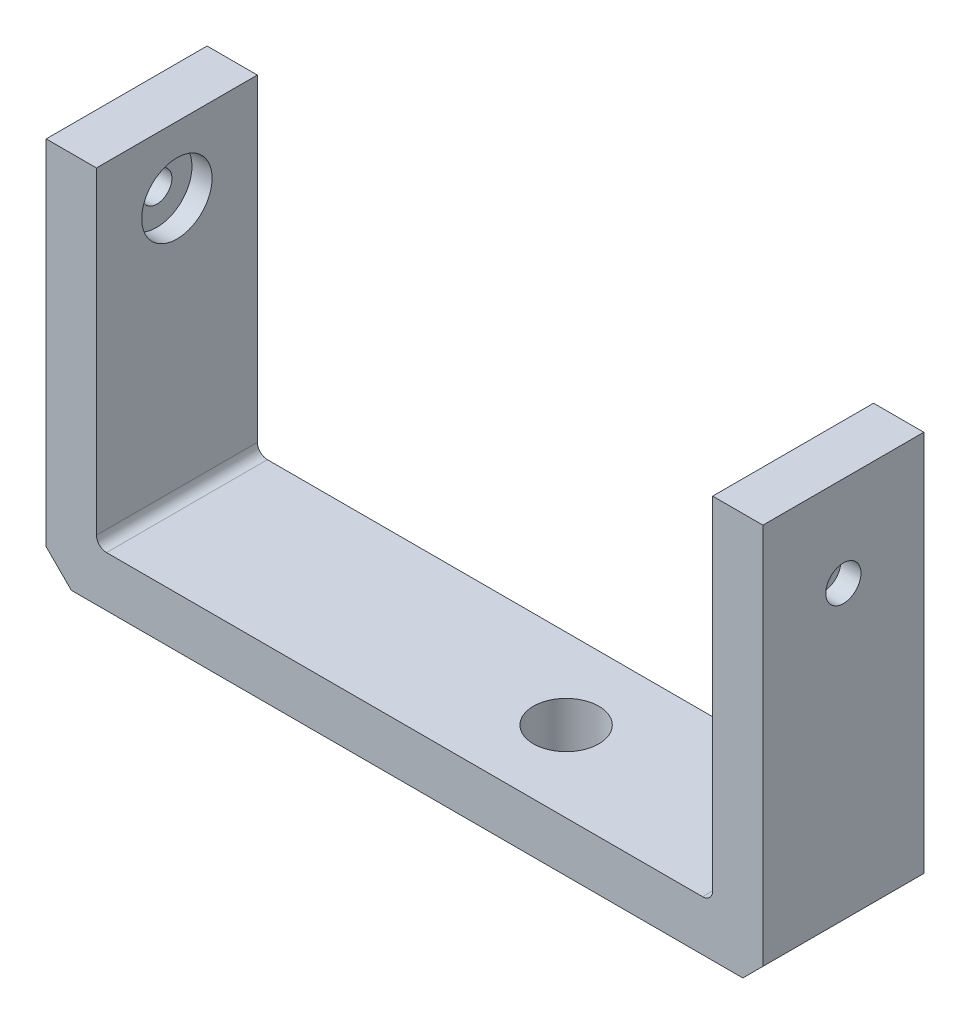
ISO-10303-21;
HEADER;
FILE_DESCRIPTION(('STEP AP214'),'2;1');
FILE_NAME('part.step','',(''),(''),'','','');
FILE_SCHEMA(('AUTOMOTIVE_DESIGN { 1 0 10303 214 1 1 1 1 }'));
ENDSEC;
DATA;
#1=APPLICATION_CONTEXT('core data for automotive mechanical design processes');
#2=APPLICATION_PROTOCOL_DEFINITION('international standard','automotive_design',2000,#1);
#3=PRODUCT_CONTEXT('',#1,'mechanical');
#4=PRODUCT('Part','Part','',(#3));
#5=PRODUCT_RELATED_PRODUCT_CATEGORY('part','',(#4));
#6=PRODUCT_DEFINITION_FORMATION('','',#4);
#7=PRODUCT_DEFINITION_CONTEXT('part definition',#1,'design');
#8=PRODUCT_DEFINITION('design','',#6,#7);
#9=PRODUCT_DEFINITION_SHAPE('','',#8);
#10=(LENGTH_UNIT() NAMED_UNIT(*) SI_UNIT(.MILLI.,.METRE.));
#11=(NAMED_UNIT(*) PLANE_ANGLE_UNIT() SI_UNIT($,.RADIAN.));
#12=(NAMED_UNIT(*) SI_UNIT($,.STERADIAN.) SOLID_ANGLE_UNIT());
#13=UNCERTAINTY_MEASURE_WITH_UNIT(LENGTH_MEASURE(1.E-05),#10,'distance_accuracy_value','');
#14=(GEOMETRIC_REPRESENTATION_CONTEXT(3) GLOBAL_UNCERTAINTY_ASSIGNED_CONTEXT((#13)) GLOBAL_UNIT_ASSIGNED_CONTEXT((#10,
#11,#12)) REPRESENTATION_CONTEXT('',''));
#15=CARTESIAN_POINT('',(0.,0.,0.));
#16=DIRECTION('',(0.,0.,1.));
#17=DIRECTION('',(1.,0.,0.));
#18=AXIS2_PLACEMENT_3D('',#15,#16,#17);
#19=CARTESIAN_POINT('',(0.,-5.48275862068966,16.));
#20=DIRECTION('',(0.,1.,0.));
#21=DIRECTION('',(0.,0.,1.));
#22=AXIS2_PLACEMENT_3D('',#19,#20,#21);
#23=PLANE('',#22);
#24=CARTESIAN_POINT('',(-11.1921641877615,-5.48275862068966,8.));
#25=DIRECTION('',(0.,1.,0.));
#26=DIRECTION('',(0.,0.,1.));
#27=AXIS2_PLACEMENT_3D('',#24,#25,#26);
#28=CIRCLE('',#27,3.25);
#29=CARTESIAN_POINT('',(-11.1921641877615,-5.48275862068966,11.25));
#30=VERTEX_POINT('',#29);
#31=EDGE_CURVE('E170',#30,#30,#28,.T.);
#32=ORIENTED_EDGE('',*,*,#31,.F.);
#33=EDGE_LOOP('',(#32));
#34=FACE_BOUND('',#33,.T.);
#35=DIRECTION('',(1.,0.,0.));
#36=VECTOR('',#35,1.);
#37=CARTESIAN_POINT('',(0.,-5.48275862068966,0.));
#38=LINE('',#37,#36);
#39=CARTESIAN_POINT('',(-48.896551724138,-5.48275862068966,0.));
#40=VERTEX_POINT('',#39);
#41=CARTESIAN_POINT('',(10.3793103448276,-5.48275862068966,0.));
#42=VERTEX_POINT('',#41);
#43=EDGE_CURVE('E196',#40,#42,#38,.T.);
#44=ORIENTED_EDGE('',*,*,#43,.F.);
#45=DIRECTION('',(0.,0.,-1.));
#46=VECTOR('',#45,1.);
#47=CARTESIAN_POINT('',(-48.896551724138,-5.48275862068966,16.));
#48=LINE('',#47,#46);
#49=CARTESIAN_POINT('',(-48.896551724138,-5.48275862068966,16.));
#50=VERTEX_POINT('',#49);
#51=EDGE_CURVE('E58',#40,#50,#48,.F.);
#52=ORIENTED_EDGE('',*,*,#51,.T.);
#53=DIRECTION('',(1.,0.,0.));
#54=VECTOR('',#53,1.);
#55=CARTESIAN_POINT('',(0.,-5.48275862068966,16.));
#56=LINE('',#55,#54);
#57=CARTESIAN_POINT('',(10.3793103448276,-5.48275862068966,16.));
#58=VERTEX_POINT('',#57);
#59=EDGE_CURVE('E182',#50,#58,#56,.T.);
#60=ORIENTED_EDGE('',*,*,#59,.T.);
#61=DIRECTION('',(0.,0.,-1.));
#62=VECTOR('',#61,1.);
#63=CARTESIAN_POINT('',(10.3793103448276,-5.48275862068966,16.));
#64=LINE('',#63,#62);
#65=EDGE_CURVE('E205',#58,#42,#64,.T.);
#66=ORIENTED_EDGE('',*,*,#65,.T.);
#67=EDGE_LOOP('',(#44,#52,#60,#66));
#68=FACE_BOUND('',#67,.T.);
#69=ADVANCED_FACE('F35',(#34,#68),#23,.T.);
#70=CARTESIAN_POINT('',(31.3793103448276,20.5172413793103,8.));
#71=DIRECTION('',(-1.,0.,0.));
#72=DIRECTION('',(0.,-1.,0.));
#73=AXIS2_PLACEMENT_3D('',#70,#71,#72);
#74=CYLINDRICAL_SURFACE('',#73,1.75);
#75=CARTESIAN_POINT('',(16.3793103448276,20.5172413793103,8.));
#76=DIRECTION('',(1.,0.,0.));
#77=DIRECTION('',(0.,1.,0.));
#78=AXIS2_PLACEMENT_3D('',#75,#76,#77);
#79=CIRCLE('',#78,1.75);
#80=CARTESIAN_POINT('',(16.3793103448276,22.2672413793103,8.));
#81=VERTEX_POINT('',#80);
#82=EDGE_CURVE('E174',#81,#81,#79,.T.);
#83=ORIENTED_EDGE('',*,*,#82,.T.);
#84=EDGE_LOOP('',(#83));
#85=FACE_BOUND('',#84,.T.);
#86=CARTESIAN_POINT('',(14.3793103448276,20.5172413793103,8.));
#87=DIRECTION('',(-1.,0.,0.));
#88=DIRECTION('',(0.,-1.,0.));
#89=AXIS2_PLACEMENT_3D('',#86,#87,#88);
#90=CIRCLE('',#89,1.75);
#91=CARTESIAN_POINT('',(14.3793103448276,18.7672413793103,8.));
#92=VERTEX_POINT('',#91);
#93=EDGE_CURVE('E169',#92,#92,#90,.F.);
#94=ORIENTED_EDGE('',*,*,#93,.F.);
#95=EDGE_LOOP('',(#94));
#96=FACE_BOUND('',#95,.T.);
#97=ADVANCED_FACE('F309',(#85,#96),#74,.F.);
#98=CARTESIAN_POINT('',(0.,29.5172413793103,16.));
#99=DIRECTION('',(0.,1.,0.));
#100=DIRECTION('',(0.,0.,1.));
#101=AXIS2_PLACEMENT_3D('',#98,#99,#100);
#102=PLANE('',#101);
#103=DIRECTION('',(1.,0.,0.));
#104=VECTOR('',#103,1.);
#105=CARTESIAN_POINT('',(0.,29.5172413793103,0.));
#106=LINE('',#105,#104);
#107=CARTESIAN_POINT('',(11.3793103448276,29.5172413793103,0.));
#108=VERTEX_POINT('',#107);
#109=CARTESIAN_POINT('',(16.3793103448276,29.5172413793103,0.));
#110=VERTEX_POINT('',#109);
#111=EDGE_CURVE('E190',#108,#110,#106,.T.);
#112=ORIENTED_EDGE('',*,*,#111,.F.);
#113=DIRECTION('',(0.,0.,-1.));
#114=VECTOR('',#113,1.);
#115=CARTESIAN_POINT('',(11.3793103448276,29.5172413793103,16.));
#116=LINE('',#115,#114);
#117=CARTESIAN_POINT('',(11.3793103448276,29.5172413793103,16.));
#118=VERTEX_POINT('',#117);
#119=EDGE_CURVE('E203',#118,#108,#116,.T.);
#120=ORIENTED_EDGE('',*,*,#119,.F.);
#121=DIRECTION('',(1.,0.,0.));
#122=VECTOR('',#121,1.);
#123=CARTESIAN_POINT('',(0.,29.5172413793103,16.));
#124=LINE('',#123,#122);
#125=CARTESIAN_POINT('',(16.3793103448276,29.5172413793103,16.));
#126=VERTEX_POINT('',#125);
#127=EDGE_CURVE('E175',#118,#126,#124,.T.);
#128=ORIENTED_EDGE('',*,*,#127,.T.);
#129=DIRECTION('',(0.,0.,-1.));
#130=VECTOR('',#129,1.);
#131=CARTESIAN_POINT('',(16.3793103448276,29.5172413793103,16.));
#132=LINE('',#131,#130);
#133=EDGE_CURVE('E189',#126,#110,#132,.T.);
#134=ORIENTED_EDGE('',*,*,#133,.T.);
#135=EDGE_LOOP('',(#112,#120,#128,#134));
#136=FACE_BOUND('',#135,.T.);
#137=ADVANCED_FACE('F259',(#136),#102,.T.);
#138=CARTESIAN_POINT('',(11.3793103448276,0.,16.));
#139=DIRECTION('',(1.,0.,0.));
#140=DIRECTION('',(0.,1.,0.));
#141=AXIS2_PLACEMENT_3D('',#138,#139,#140);
#142=PLANE('',#141);
#143=CARTESIAN_POINT('',(11.3793103448276,20.5172413793103,8.));
#144=DIRECTION('',(-1.,0.,0.));
#145=DIRECTION('',(0.,-1.,0.));
#146=AXIS2_PLACEMENT_3D('',#143,#144,#145);
#147=CIRCLE('',#146,3.);
#148=CARTESIAN_POINT('',(11.3793103448276,17.5172413793103,8.));
#149=VERTEX_POINT('',#148);
#150=EDGE_CURVE('E166',#149,#149,#147,.T.);
#151=ORIENTED_EDGE('',*,*,#150,.F.);
#152=EDGE_LOOP('',(#151));
#153=FACE_BOUND('',#152,.T.);
#154=DIRECTION('',(0.,-1.,0.));
#155=VECTOR('',#154,1.);
#156=CARTESIAN_POINT('',(11.3793103448276,0.,0.));
#157=LINE('',#156,#155);
#158=CARTESIAN_POINT('',(11.3793103448276,-4.48275862068966,0.));
#159=VERTEX_POINT('',#158);
#160=EDGE_CURVE('E193',#108,#159,#157,.T.);
#161=ORIENTED_EDGE('',*,*,#160,.T.);
#162=DIRECTION('',(0.,0.,-1.));
#163=VECTOR('',#162,1.);
#164=CARTESIAN_POINT('',(11.3793103448276,-4.48275862068966,16.));
#165=LINE('',#164,#163);
#166=CARTESIAN_POINT('',(11.3793103448276,-4.48275862068966,16.));
#167=VERTEX_POINT('',#166);
#168=EDGE_CURVE('E210',#159,#167,#165,.F.);
#169=ORIENTED_EDGE('',*,*,#168,.T.);
#170=DIRECTION('',(0.,-1.,0.));
#171=VECTOR('',#170,1.);
#172=CARTESIAN_POINT('',(11.3793103448276,0.,16.));
#173=LINE('',#172,#171);
#174=EDGE_CURVE('E178',#118,#167,#173,.T.);
#175=ORIENTED_EDGE('',*,*,#174,.F.);
#176=ORIENTED_EDGE('',*,*,#119,.T.);
#177=EDGE_LOOP('',(#161,#169,#175,#176));
#178=FACE_BOUND('',#177,.T.);
#179=ADVANCED_FACE('F257',(#153,#178),#142,.F.);
#180=CARTESIAN_POINT('',(0.,-10.4827586206897,16.));
#181=DIRECTION('',(0.,1.,0.));
#182=DIRECTION('',(0.,0.,1.));
#183=AXIS2_PLACEMENT_3D('',#180,#181,#182);
#184=PLANE('',#183);
#185=CARTESIAN_POINT('',(-11.1921641877615,-10.4827586206897,8.));
#186=DIRECTION('',(0.,1.,0.));
#187=DIRECTION('',(0.,0.,1.));
#188=AXIS2_PLACEMENT_3D('',#185,#186,#187);
#189=CIRCLE('',#188,3.25);
#190=CARTESIAN_POINT('',(-11.1921641877615,-10.4827586206897,11.25));
#191=VERTEX_POINT('',#190);
#192=EDGE_CURVE('E173',#191,#191,#189,.T.);
#193=ORIENTED_EDGE('',*,*,#192,.T.);
#194=EDGE_LOOP('',(#193));
#195=FACE_BOUND('',#194,.T.);
#196=DIRECTION('',(1.,0.,0.));
#197=VECTOR('',#196,1.);
#198=CARTESIAN_POINT('',(0.,-10.4827586206897,16.));
#199=LINE('',#198,#197);
#200=CARTESIAN_POINT('',(-52.3965517241379,-10.4827586206897,16.));
#201=VERTEX_POINT('',#200);
#202=CARTESIAN_POINT('',(14.3793103448276,-10.4827586206897,16.));
#203=VERTEX_POINT('',#202);
#204=EDGE_CURVE('E184',#201,#203,#199,.T.);
#205=ORIENTED_EDGE('',*,*,#204,.F.);
#206=DIRECTION('',(0.,0.,-1.));
#207=VECTOR('',#206,1.);
#208=CARTESIAN_POINT('',(-52.3965517241379,-10.4827586206897,0.));
#209=LINE('',#208,#207);
#210=CARTESIAN_POINT('',(-52.3965517241379,-10.4827586206897,0.));
#211=VERTEX_POINT('',#210);
#212=EDGE_CURVE('E237',#201,#211,#209,.T.);
#213=ORIENTED_EDGE('',*,*,#212,.T.);
#214=DIRECTION('',(1.,0.,0.));
#215=VECTOR('',#214,1.);
#216=CARTESIAN_POINT('',(0.,-10.4827586206897,0.));
#217=LINE('',#216,#215);
#218=CARTESIAN_POINT('',(14.3793103448276,-10.4827586206897,0.));
#219=VERTEX_POINT('',#218);
#220=EDGE_CURVE('E198',#211,#219,#217,.T.);
#221=ORIENTED_EDGE('',*,*,#220,.T.);
#222=DIRECTION('',(0.,0.,1.));
#223=VECTOR('',#222,1.);
#224=CARTESIAN_POINT('',(14.3793103448276,-10.4827586206897,16.));
#225=LINE('',#224,#223);
#226=EDGE_CURVE('E223',#219,#203,#225,.T.);
#227=ORIENTED_EDGE('',*,*,#226,.T.);
#228=EDGE_LOOP('',(#205,#213,#221,#227));
#229=FACE_BOUND('',#228,.T.);
#230=ADVANCED_FACE('F322',(#195,#229),#184,.F.);
#231=CARTESIAN_POINT('',(16.3793103448276,0.,16.));
#232=DIRECTION('',(1.,0.,0.));
#233=DIRECTION('',(0.,1.,0.));
#234=AXIS2_PLACEMENT_3D('',#231,#232,#233);
#235=PLANE('',#234);
#236=ORIENTED_EDGE('',*,*,#82,.F.);
#237=EDGE_LOOP('',(#236));
#238=FACE_BOUND('',#237,.T.);
#239=DIRECTION('',(0.,-1.,0.));
#240=VECTOR('',#239,1.);
#241=CARTESIAN_POINT('',(16.3793103448276,0.,16.));
#242=LINE('',#241,#240);
#243=CARTESIAN_POINT('',(16.3793103448276,-8.48275862068966,16.));
#244=VERTEX_POINT('',#243);
#245=EDGE_CURVE('E186',#126,#244,#242,.T.);
#246=ORIENTED_EDGE('',*,*,#245,.T.);
#247=DIRECTION('',(0.,0.,-1.));
#248=VECTOR('',#247,1.);
#249=CARTESIAN_POINT('',(16.3793103448276,-8.48275862068966,0.));
#250=LINE('',#249,#248);
#251=CARTESIAN_POINT('',(16.3793103448276,-8.48275862068966,0.));
#252=VERTEX_POINT('',#251);
#253=EDGE_CURVE('E217',#244,#252,#250,.T.);
#254=ORIENTED_EDGE('',*,*,#253,.T.);
#255=DIRECTION('',(0.,-1.,0.));
#256=VECTOR('',#255,1.);
#257=CARTESIAN_POINT('',(16.3793103448276,0.,0.));
#258=LINE('',#257,#256);
#259=EDGE_CURVE('E179',#110,#252,#258,.T.);
#260=ORIENTED_EDGE('',*,*,#259,.F.);
#261=ORIENTED_EDGE('',*,*,#133,.F.);
#262=EDGE_LOOP('',(#246,#254,#260,#261));
#263=FACE_BOUND('',#262,.T.);
#264=ADVANCED_FACE('F263',(#238,#263),#235,.T.);
#265=CARTESIAN_POINT('',(0.,0.,16.));
#266=DIRECTION('',(0.,0.,1.));
#267=DIRECTION('',(1.,0.,0.));
#268=AXIS2_PLACEMENT_3D('',#265,#266,#267);
#269=PLANE('',#268);
#270=DIRECTION('',(1.,0.,0.));
#271=VECTOR('',#270,1.);
#272=CARTESIAN_POINT('',(-61.896551724138,27.140932446315,16.));
#273=LINE('',#272,#271);
#274=CARTESIAN_POINT('',(-54.8965517241379,27.140932446315,16.));
#275=VERTEX_POINT('',#274);
#276=CARTESIAN_POINT('',(-49.896551724138,27.140932446315,16.));
#277=VERTEX_POINT('',#276);
#278=EDGE_CURVE('E50',#275,#277,#273,.T.);
#279=ORIENTED_EDGE('',*,*,#278,.F.);
#280=DIRECTION('',(0.,1.,0.));
#281=VECTOR('',#280,1.);
#282=CARTESIAN_POINT('',(-54.8965517241379,-5.48275862068965,16.));
#283=LINE('',#282,#281);
#284=CARTESIAN_POINT('',(-54.8965517241379,-7.98275862068966,16.));
#285=VERTEX_POINT('',#284);
#286=EDGE_CURVE('E154',#285,#275,#283,.T.);
#287=ORIENTED_EDGE('',*,*,#286,.F.);
#288=DIRECTION('',(0.707106781186549,-0.707106781186547,0.));
#289=VECTOR('',#288,1.);
#290=CARTESIAN_POINT('',(-31.4396551724137,-31.4396551724138,16.));
#291=LINE('',#290,#289);
#292=EDGE_CURVE('E235',#285,#201,#291,.T.);
#293=ORIENTED_EDGE('',*,*,#292,.T.);
#294=ORIENTED_EDGE('',*,*,#204,.T.);
#295=DIRECTION('',(0.707106781186549,0.707106781186546,0.));
#296=VECTOR('',#295,1.);
#297=CARTESIAN_POINT('',(12.4310344827586,-12.4310344827586,16.));
#298=LINE('',#297,#296);
#299=EDGE_CURVE('E226',#203,#244,#298,.T.);
#300=ORIENTED_EDGE('',*,*,#299,.T.);
#301=ORIENTED_EDGE('',*,*,#245,.F.);
#302=ORIENTED_EDGE('',*,*,#127,.F.);
#303=ORIENTED_EDGE('',*,*,#174,.T.);
#304=CARTESIAN_POINT('',(10.3793103448276,-4.48275862068966,16.));
#305=DIRECTION('',(0.,0.,1.));
#306=DIRECTION('',(1.,0.,0.));
#307=AXIS2_PLACEMENT_3D('',#304,#305,#306);
#308=CIRCLE('',#307,1.);
#309=EDGE_CURVE('E214',#167,#58,#308,.F.);
#310=ORIENTED_EDGE('',*,*,#309,.T.);
#311=ORIENTED_EDGE('',*,*,#59,.F.);
#312=CARTESIAN_POINT('',(-48.896551724138,-4.48275862068966,16.));
#313=DIRECTION('',(0.,0.,1.));
#314=DIRECTION('',(1.,0.,0.));
#315=AXIS2_PLACEMENT_3D('',#312,#313,#314);
#316=CIRCLE('',#315,1.);
#317=CARTESIAN_POINT('',(-49.896551724138,-4.48275862068966,16.));
#318=VERTEX_POINT('',#317);
#319=EDGE_CURVE('E11',#50,#318,#316,.F.);
#320=ORIENTED_EDGE('',*,*,#319,.T.);
#321=DIRECTION('',(0.,-1.,0.));
#322=VECTOR('',#321,1.);
#323=CARTESIAN_POINT('',(-49.896551724138,31.5172413793103,16.));
#324=LINE('',#323,#322);
#325=EDGE_CURVE('E144',#277,#318,#324,.T.);
#326=ORIENTED_EDGE('',*,*,#325,.F.);
#327=EDGE_LOOP('',(#279,#287,#293,#294,#300,#301,#302,#303,#310,#311,#320,#326));
#328=FACE_BOUND('',#327,.T.);
#329=ADVANCED_FACE('F247',(#328),#269,.T.);
#330=CARTESIAN_POINT('',(0.,0.,0.));
#331=DIRECTION('',(0.,0.,1.));
#332=DIRECTION('',(1.,0.,0.));
#333=AXIS2_PLACEMENT_3D('',#330,#331,#332);
#334=PLANE('',#333);
#335=DIRECTION('',(0.,-1.,0.));
#336=VECTOR('',#335,1.);
#337=CARTESIAN_POINT('',(-54.8965517241379,-5.48275862068965,0.));
#338=LINE('',#337,#336);
#339=CARTESIAN_POINT('',(-54.8965517241379,27.140932446315,0.));
#340=VERTEX_POINT('',#339);
#341=CARTESIAN_POINT('',(-54.8965517241379,-7.98275862068966,0.));
#342=VERTEX_POINT('',#341);
#343=EDGE_CURVE('E137',#340,#342,#338,.T.);
#344=ORIENTED_EDGE('',*,*,#343,.F.);
#345=DIRECTION('',(1.,0.,0.));
#346=VECTOR('',#345,1.);
#347=CARTESIAN_POINT('',(-61.896551724138,27.140932446315,0.));
#348=LINE('',#347,#346);
#349=CARTESIAN_POINT('',(-49.896551724138,27.140932446315,0.));
#350=VERTEX_POINT('',#349);
#351=EDGE_CURVE('E125',#340,#350,#348,.T.);
#352=ORIENTED_EDGE('',*,*,#351,.T.);
#353=DIRECTION('',(0.,-1.,0.));
#354=VECTOR('',#353,1.);
#355=CARTESIAN_POINT('',(-49.896551724138,31.5172413793103,0.));
#356=LINE('',#355,#354);
#357=CARTESIAN_POINT('',(-49.896551724138,-4.48275862068966,0.));
#358=VERTEX_POINT('',#357);
#359=EDGE_CURVE('E134',#350,#358,#356,.T.);
#360=ORIENTED_EDGE('',*,*,#359,.T.);
#361=CARTESIAN_POINT('',(-48.896551724138,-4.48275862068966,0.));
#362=DIRECTION('',(0.,0.,1.));
#363=DIRECTION('',(1.,0.,0.));
#364=AXIS2_PLACEMENT_3D('',#361,#362,#363);
#365=CIRCLE('',#364,1.);
#366=EDGE_CURVE('E43',#358,#40,#365,.T.);
#367=ORIENTED_EDGE('',*,*,#366,.T.);
#368=ORIENTED_EDGE('',*,*,#43,.T.);
#369=CARTESIAN_POINT('',(10.3793103448276,-4.48275862068966,0.));
#370=DIRECTION('',(0.,0.,1.));
#371=DIRECTION('',(1.,0.,0.));
#372=AXIS2_PLACEMENT_3D('',#369,#370,#371);
#373=CIRCLE('',#372,1.);
#374=EDGE_CURVE('E212',#42,#159,#373,.T.);
#375=ORIENTED_EDGE('',*,*,#374,.T.);
#376=ORIENTED_EDGE('',*,*,#160,.F.);
#377=ORIENTED_EDGE('',*,*,#111,.T.);
#378=ORIENTED_EDGE('',*,*,#259,.T.);
#379=DIRECTION('',(-0.707106781186549,-0.707106781186546,0.));
#380=VECTOR('',#379,1.);
#381=CARTESIAN_POINT('',(16.3793103448276,-8.48275862068965,0.));
#382=LINE('',#381,#380);
#383=EDGE_CURVE('E220',#252,#219,#382,.T.);
#384=ORIENTED_EDGE('',*,*,#383,.T.);
#385=ORIENTED_EDGE('',*,*,#220,.F.);
#386=DIRECTION('',(-0.707106781186549,0.707106781186547,0.));
#387=VECTOR('',#386,1.);
#388=CARTESIAN_POINT('',(-54.8965517241379,-7.98275862068966,0.));
#389=LINE('',#388,#387);
#390=EDGE_CURVE('E239',#211,#342,#389,.T.);
#391=ORIENTED_EDGE('',*,*,#390,.T.);
#392=EDGE_LOOP('',(#344,#352,#360,#367,#368,#375,#376,#377,#378,#384,#385,#391));
#393=FACE_BOUND('',#392,.T.);
#394=ADVANCED_FACE('F133',(#393),#334,.F.);
#395=CARTESIAN_POINT('',(-11.1921641877615,-25.4827586206897,8.));
#396=DIRECTION('',(0.,1.,0.));
#397=DIRECTION('',(0.,0.,1.));
#398=AXIS2_PLACEMENT_3D('',#395,#396,#397);
#399=CYLINDRICAL_SURFACE('',#398,3.25);
#400=ORIENTED_EDGE('',*,*,#31,.T.);
#401=EDGE_LOOP('',(#400));
#402=FACE_BOUND('',#401,.T.);
#403=ORIENTED_EDGE('',*,*,#192,.F.);
#404=EDGE_LOOP('',(#403));
#405=FACE_BOUND('',#404,.T.);
#406=ADVANCED_FACE('F331',(#402,#405),#399,.F.);
#407=CARTESIAN_POINT('',(10.3793103448276,-4.48275862068966,16.));
#408=DIRECTION('',(0.,0.,-1.));
#409=DIRECTION('',(-1.,0.,0.));
#410=AXIS2_PLACEMENT_3D('',#407,#408,#409);
#411=CYLINDRICAL_SURFACE('',#410,1.);
#412=ORIENTED_EDGE('',*,*,#309,.F.);
#413=ORIENTED_EDGE('',*,*,#168,.F.);
#414=ORIENTED_EDGE('',*,*,#374,.F.);
#415=ORIENTED_EDGE('',*,*,#65,.F.);
#416=EDGE_LOOP('',(#412,#413,#414,#415));
#417=FACE_BOUND('',#416,.T.);
#418=ADVANCED_FACE('F253',(#417),#411,.F.);
#419=CARTESIAN_POINT('',(16.3793103448276,-8.48275862068965,16.));
#420=DIRECTION('',(0.707106781186546,-0.707106781186549,0.));
#421=DIRECTION('',(0.,0.,1.));
#422=AXIS2_PLACEMENT_3D('',#419,#420,#421);
#423=PLANE('',#422);
#424=ORIENTED_EDGE('',*,*,#299,.F.);
#425=ORIENTED_EDGE('',*,*,#226,.F.);
#426=ORIENTED_EDGE('',*,*,#383,.F.);
#427=ORIENTED_EDGE('',*,*,#253,.F.);
#428=EDGE_LOOP('',(#424,#425,#426,#427));
#429=FACE_BOUND('',#428,.T.);
#430=ADVANCED_FACE('F267',(#429),#423,.T.);
#431=CARTESIAN_POINT('',(14.3793103448276,20.5172413793103,8.));
#432=DIRECTION('',(-1.,0.,0.));
#433=DIRECTION('',(0.,-1.,0.));
#434=AXIS2_PLACEMENT_3D('',#431,#432,#433);
#435=CYLINDRICAL_SURFACE('',#434,3.);
#436=CARTESIAN_POINT('',(12.3793103448276,20.5172413793103,8.));
#437=DIRECTION('',(-1.,0.,0.));
#438=DIRECTION('',(0.,-1.,0.));
#439=AXIS2_PLACEMENT_3D('',#436,#437,#438);
#440=CIRCLE('',#439,3.);
#441=CARTESIAN_POINT('',(12.3793103448276,17.5172413793103,8.));
#442=VERTEX_POINT('',#441);
#443=EDGE_CURVE('E161',#442,#442,#440,.T.);
#444=ORIENTED_EDGE('',*,*,#443,.F.);
#445=EDGE_LOOP('',(#444));
#446=FACE_BOUND('',#445,.T.);
#447=ORIENTED_EDGE('',*,*,#150,.T.);
#448=EDGE_LOOP('',(#447));
#449=FACE_BOUND('',#448,.T.);
#450=ADVANCED_FACE('F333',(#446,#449),#435,.F.);
#451=CARTESIAN_POINT('',(12.3793103448276,20.5172413793103,8.));
#452=DIRECTION('',(-1.,0.,0.));
#453=DIRECTION('',(0.,-1.,0.));
#454=AXIS2_PLACEMENT_3D('',#451,#452,#453);
#455=PLANE('',#454);
#456=CARTESIAN_POINT('',(12.3793103448276,20.5172413793103,8.));
#457=DIRECTION('',(-1.,0.,0.));
#458=DIRECTION('',(0.,-1.,0.));
#459=AXIS2_PLACEMENT_3D('',#456,#457,#458);
#460=CIRCLE('',#459,1.);
#461=CARTESIAN_POINT('',(12.3793103448276,19.5172413793103,8.));
#462=VERTEX_POINT('',#461);
#463=EDGE_CURVE('E157',#462,#462,#460,.T.);
#464=ORIENTED_EDGE('',*,*,#463,.F.);
#465=EDGE_LOOP('',(#464));
#466=FACE_BOUND('',#465,.T.);
#467=ORIENTED_EDGE('',*,*,#443,.T.);
#468=EDGE_LOOP('',(#467));
#469=FACE_BOUND('',#468,.T.);
#470=ADVANCED_FACE('F473',(#466,#469),#455,.T.);
#471=CARTESIAN_POINT('',(14.3793103448276,20.5172413793103,8.));
#472=DIRECTION('',(-1.,0.,0.));
#473=DIRECTION('',(0.,-1.,0.));
#474=AXIS2_PLACEMENT_3D('',#471,#472,#473);
#475=PLANE('',#474);
#476=CARTESIAN_POINT('',(14.3793103448276,20.5172413793103,8.));
#477=DIRECTION('',(-1.,0.,0.));
#478=DIRECTION('',(0.,-1.,0.));
#479=AXIS2_PLACEMENT_3D('',#476,#477,#478);
#480=CIRCLE('',#479,1.);
#481=CARTESIAN_POINT('',(14.3793103448276,19.5172413793103,8.));
#482=VERTEX_POINT('',#481);
#483=EDGE_CURVE('E158',#482,#482,#480,.T.);
#484=ORIENTED_EDGE('',*,*,#483,.T.);
#485=EDGE_LOOP('',(#484));
#486=FACE_BOUND('',#485,.T.);
#487=ORIENTED_EDGE('',*,*,#93,.T.);
#488=EDGE_LOOP('',(#487));
#489=FACE_BOUND('',#488,.T.);
#490=ADVANCED_FACE('F481',(#486,#489),#475,.F.);
#491=CARTESIAN_POINT('',(14.3793103448276,20.5172413793103,8.));
#492=DIRECTION('',(-1.,0.,0.));
#493=DIRECTION('',(0.,-1.,0.));
#494=AXIS2_PLACEMENT_3D('',#491,#492,#493);
#495=CYLINDRICAL_SURFACE('',#494,1.);
#496=ORIENTED_EDGE('',*,*,#483,.F.);
#497=EDGE_LOOP('',(#496));
#498=FACE_BOUND('',#497,.T.);
#499=ORIENTED_EDGE('',*,*,#463,.T.);
#500=EDGE_LOOP('',(#499));
#501=FACE_BOUND('',#500,.T.);
#502=ADVANCED_FACE('F305',(#498,#501),#495,.F.);
#503=CARTESIAN_POINT('',(-54.8965517241379,0.,0.));
#504=DIRECTION('',(-1.,0.,0.));
#505=DIRECTION('',(0.,0.,1.));
#506=AXIS2_PLACEMENT_3D('',#503,#504,#505);
#507=PLANE('',#506);
#508=DIRECTION('',(0.,0.,1.));
#509=VECTOR('',#508,1.);
#510=CARTESIAN_POINT('',(-54.8965517241379,27.140932446315,0.));
#511=LINE('',#510,#509);
#512=EDGE_CURVE('E138',#340,#275,#511,.T.);
#513=ORIENTED_EDGE('',*,*,#512,.F.);
#514=ORIENTED_EDGE('',*,*,#343,.T.);
#515=DIRECTION('',(0.,0.,1.));
#516=VECTOR('',#515,1.);
#517=CARTESIAN_POINT('',(-54.8965517241379,-7.98275862068966,16.));
#518=LINE('',#517,#516);
#519=EDGE_CURVE('E228',#342,#285,#518,.T.);
#520=ORIENTED_EDGE('',*,*,#519,.T.);
#521=ORIENTED_EDGE('',*,*,#286,.T.);
#522=EDGE_LOOP('',(#513,#514,#520,#521));
#523=FACE_BOUND('',#522,.T.);
#524=CARTESIAN_POINT('',(-54.8965517241379,20.5172413793103,8.));
#525=DIRECTION('',(-1.,0.,0.));
#526=DIRECTION('',(0.,0.,1.));
#527=AXIS2_PLACEMENT_3D('',#524,#525,#526);
#528=CIRCLE('',#527,1.5);
#529=CARTESIAN_POINT('',(-54.8965517241379,20.5172413793103,9.5));
#530=VERTEX_POINT('',#529);
#531=EDGE_CURVE('E287',#530,#530,#528,.T.);
#532=ORIENTED_EDGE('',*,*,#531,.F.);
#533=EDGE_LOOP('',(#532));
#534=FACE_BOUND('',#533,.T.);
#535=ADVANCED_FACE('F278',(#523,#534),#507,.T.);
#536=CARTESIAN_POINT('',(-49.896551724138,31.5172413793103,16.));
#537=DIRECTION('',(-1.,0.,0.));
#538=DIRECTION('',(0.,0.,1.));
#539=AXIS2_PLACEMENT_3D('',#536,#537,#538);
#540=PLANE('',#539);
#541=CARTESIAN_POINT('',(-49.896551724138,20.5172413793103,8.));
#542=DIRECTION('',(1.,0.,0.));
#543=DIRECTION('',(0.,0.,-1.));
#544=AXIS2_PLACEMENT_3D('',#541,#542,#543);
#545=CIRCLE('',#544,3.5);
#546=CARTESIAN_POINT('',(-49.896551724138,20.5172413793103,4.5));
#547=VERTEX_POINT('',#546);
#548=EDGE_CURVE('E149',#547,#547,#545,.T.);
#549=ORIENTED_EDGE('',*,*,#548,.F.);
#550=EDGE_LOOP('',(#549));
#551=FACE_BOUND('',#550,.T.);
#552=ORIENTED_EDGE('',*,*,#359,.F.);
#553=DIRECTION('',(0.,0.,-1.));
#554=VECTOR('',#553,1.);
#555=CARTESIAN_POINT('',(-49.896551724138,27.140932446315,16.));
#556=LINE('',#555,#554);
#557=EDGE_CURVE('E122',#277,#350,#556,.T.);
#558=ORIENTED_EDGE('',*,*,#557,.F.);
#559=ORIENTED_EDGE('',*,*,#325,.T.);
#560=DIRECTION('',(0.,0.,-1.));
#561=VECTOR('',#560,1.);
#562=CARTESIAN_POINT('',(-49.896551724138,-4.48275862068966,16.));
#563=LINE('',#562,#561);
#564=EDGE_CURVE('E143',#318,#358,#563,.T.);
#565=ORIENTED_EDGE('',*,*,#564,.T.);
#566=EDGE_LOOP('',(#552,#558,#559,#565));
#567=FACE_BOUND('',#566,.T.);
#568=ADVANCED_FACE('F141',(#551,#567),#540,.F.);
#569=CARTESIAN_POINT('',(-51.896551724138,20.5172413793103,8.));
#570=DIRECTION('',(1.,0.,0.));
#571=DIRECTION('',(0.,0.,-1.));
#572=AXIS2_PLACEMENT_3D('',#569,#570,#571);
#573=PLANE('',#572);
#574=CARTESIAN_POINT('',(-51.896551724138,20.5172413793103,8.));
#575=DIRECTION('',(1.,0.,0.));
#576=DIRECTION('',(0.,0.,-1.));
#577=AXIS2_PLACEMENT_3D('',#574,#575,#576);
#578=CIRCLE('',#577,1.5);
#579=CARTESIAN_POINT('',(-51.896551724138,20.5172413793103,6.5));
#580=VERTEX_POINT('',#579);
#581=EDGE_CURVE('E284',#580,#580,#578,.T.);
#582=ORIENTED_EDGE('',*,*,#581,.F.);
#583=EDGE_LOOP('',(#582));
#584=FACE_BOUND('',#583,.T.);
#585=CARTESIAN_POINT('',(-51.896551724138,20.5172413793103,8.));
#586=DIRECTION('',(1.,0.,0.));
#587=DIRECTION('',(0.,0.,-1.));
#588=AXIS2_PLACEMENT_3D('',#585,#586,#587);
#589=CIRCLE('',#588,3.5);
#590=CARTESIAN_POINT('',(-51.896551724138,20.5172413793103,4.5));
#591=VERTEX_POINT('',#590);
#592=EDGE_CURVE('E145',#591,#591,#589,.T.);
#593=ORIENTED_EDGE('',*,*,#592,.T.);
#594=EDGE_LOOP('',(#593));
#595=FACE_BOUND('',#594,.T.);
#596=ADVANCED_FACE('F297',(#584,#595),#573,.T.);
#597=CARTESIAN_POINT('',(-51.896551724138,20.5172413793103,8.));
#598=DIRECTION('',(1.,0.,0.));
#599=DIRECTION('',(0.,0.,-1.));
#600=AXIS2_PLACEMENT_3D('',#597,#598,#599);
#601=CYLINDRICAL_SURFACE('',#600,3.5);
#602=ORIENTED_EDGE('',*,*,#592,.F.);
#603=EDGE_LOOP('',(#602));
#604=FACE_BOUND('',#603,.T.);
#605=ORIENTED_EDGE('',*,*,#548,.T.);
#606=EDGE_LOOP('',(#605));
#607=FACE_BOUND('',#606,.T.);
#608=ADVANCED_FACE('F294',(#604,#607),#601,.F.);
#609=CARTESIAN_POINT('',(-63.896551724138,20.5172413793103,8.));
#610=DIRECTION('',(1.,0.,0.));
#611=DIRECTION('',(0.,0.,-1.));
#612=AXIS2_PLACEMENT_3D('',#609,#610,#611);
#613=CYLINDRICAL_SURFACE('',#612,1.5);
#614=ORIENTED_EDGE('',*,*,#531,.T.);
#615=EDGE_LOOP('',(#614));
#616=FACE_BOUND('',#615,.T.);
#617=ORIENTED_EDGE('',*,*,#581,.T.);
#618=EDGE_LOOP('',(#617));
#619=FACE_BOUND('',#618,.T.);
#620=ADVANCED_FACE('F335',(#616,#619),#613,.F.);
#621=CARTESIAN_POINT('',(-54.8965517241379,-7.98275862068966,0.));
#622=DIRECTION('',(-0.707106781186546,-0.707106781186548,0.));
#623=DIRECTION('',(0.,0.,-1.));
#624=AXIS2_PLACEMENT_3D('',#621,#622,#623);
#625=PLANE('',#624);
#626=ORIENTED_EDGE('',*,*,#390,.F.);
#627=ORIENTED_EDGE('',*,*,#212,.F.);
#628=ORIENTED_EDGE('',*,*,#292,.F.);
#629=ORIENTED_EDGE('',*,*,#519,.F.);
#630=EDGE_LOOP('',(#626,#627,#628,#629));
#631=FACE_BOUND('',#630,.T.);
#632=ADVANCED_FACE('F275',(#631),#625,.T.);
#633=CARTESIAN_POINT('',(-48.896551724138,-4.48275862068966,16.));
#634=DIRECTION('',(0.,0.,-1.));
#635=DIRECTION('',(-1.,0.,0.));
#636=AXIS2_PLACEMENT_3D('',#633,#634,#635);
#637=CYLINDRICAL_SURFACE('',#636,1.);
#638=ORIENTED_EDGE('',*,*,#319,.F.);
#639=ORIENTED_EDGE('',*,*,#51,.F.);
#640=ORIENTED_EDGE('',*,*,#366,.F.);
#641=ORIENTED_EDGE('',*,*,#564,.F.);
#642=EDGE_LOOP('',(#638,#639,#640,#641));
#643=FACE_BOUND('',#642,.T.);
#644=ADVANCED_FACE('F37',(#643),#637,.F.);
#645=CARTESIAN_POINT('',(-61.896551724138,27.140932446315,16.));
#646=DIRECTION('',(0.,-1.,0.));
#647=DIRECTION('',(0.,0.,-1.));
#648=AXIS2_PLACEMENT_3D('',#645,#646,#647);
#649=PLANE('',#648);
#650=ORIENTED_EDGE('',*,*,#512,.T.);
#651=ORIENTED_EDGE('',*,*,#278,.T.);
#652=ORIENTED_EDGE('',*,*,#557,.T.);
#653=ORIENTED_EDGE('',*,*,#351,.F.);
#654=EDGE_LOOP('',(#650,#651,#652,#653));
#655=FACE_BOUND('',#654,.T.);
#656=ADVANCED_FACE('F124',(#655),#649,.F.);
#657=CLOSED_SHELL('',(#69,#97,#137,#179,#230,#264,#329,#394,#406,#418,#430,#450,#470,#490,#502,
#535,#568,#596,#608,#620,#632,#644,#656));
#658=MANIFOLD_SOLID_BREP('B2',#657);
#659=ADVANCED_BREP_SHAPE_REPRESENTATION('',(#18,#658),#14);
#660=SHAPE_DEFINITION_REPRESENTATION(#9,#659);
ENDSEC;
END-ISO-10303-21;
